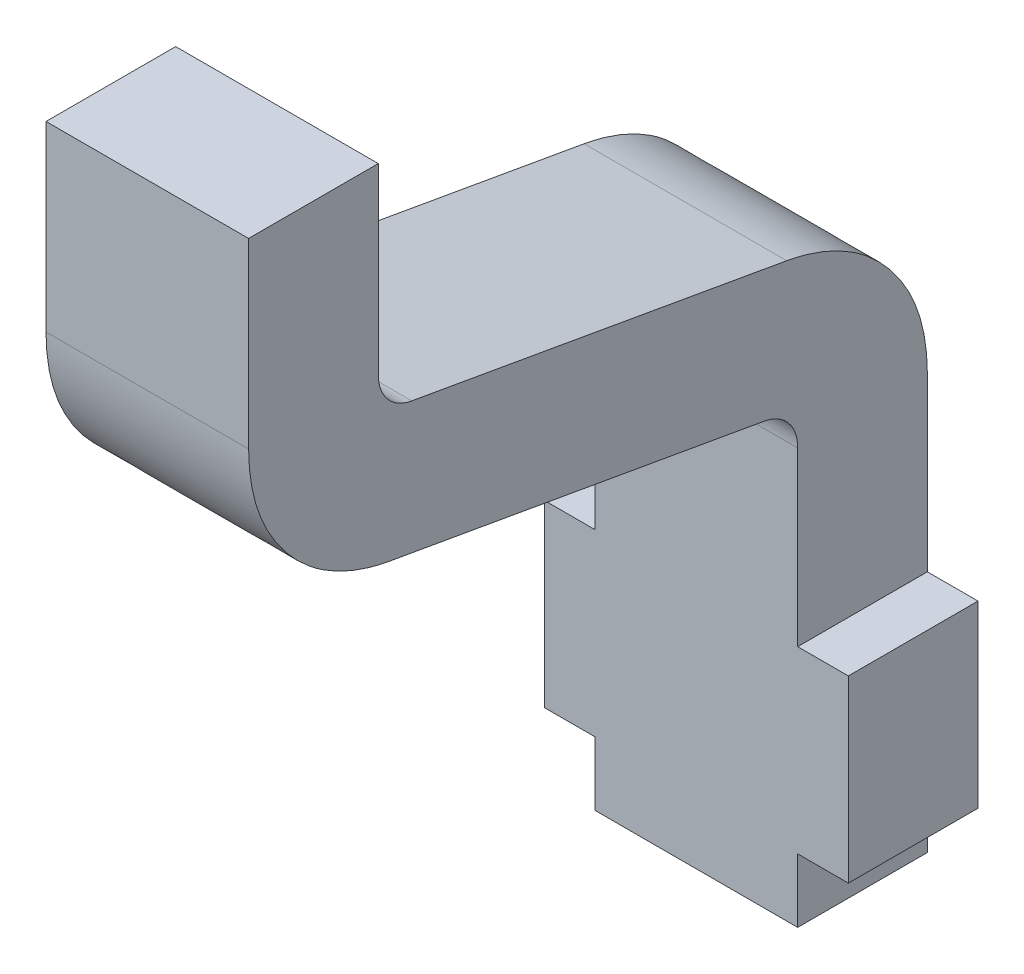
ISO-10303-21;
HEADER;
FILE_DESCRIPTION(('STEP AP214'),'2;1');
FILE_NAME('part.step','',(''),(''),'','','');
FILE_SCHEMA(('AUTOMOTIVE_DESIGN { 1 0 10303 214 1 1 1 1 }'));
ENDSEC;
DATA;
#1=APPLICATION_CONTEXT('core data for automotive mechanical design processes');
#2=APPLICATION_PROTOCOL_DEFINITION('international standard','automotive_design',2000,#1);
#3=PRODUCT_CONTEXT('',#1,'mechanical');
#4=PRODUCT('Part','Part','',(#3));
#5=PRODUCT_RELATED_PRODUCT_CATEGORY('part','',(#4));
#6=PRODUCT_DEFINITION_FORMATION('','',#4);
#7=PRODUCT_DEFINITION_CONTEXT('part definition',#1,'design');
#8=PRODUCT_DEFINITION('design','',#6,#7);
#9=PRODUCT_DEFINITION_SHAPE('','',#8);
#10=(LENGTH_UNIT() NAMED_UNIT(*) SI_UNIT(.MILLI.,.METRE.));
#11=(NAMED_UNIT(*) PLANE_ANGLE_UNIT() SI_UNIT($,.RADIAN.));
#12=(NAMED_UNIT(*) SI_UNIT($,.STERADIAN.) SOLID_ANGLE_UNIT());
#13=UNCERTAINTY_MEASURE_WITH_UNIT(LENGTH_MEASURE(1.E-05),#10,'distance_accuracy_value','');
#14=(GEOMETRIC_REPRESENTATION_CONTEXT(3) GLOBAL_UNCERTAINTY_ASSIGNED_CONTEXT((#13)) GLOBAL_UNIT_ASSIGNED_CONTEXT((#10,
#11,#12)) REPRESENTATION_CONTEXT('',''));
#15=CARTESIAN_POINT('',(0.,0.,0.));
#16=DIRECTION('',(0.,0.,1.));
#17=DIRECTION('',(1.,0.,0.));
#18=AXIS2_PLACEMENT_3D('',#15,#16,#17);
#19=CARTESIAN_POINT('',(-4.23863807396374,4.550984547896,3.510984547896));
#20=DIRECTION('',(-1.,0.,0.));
#21=DIRECTION('',(0.,0.,1.));
#22=AXIS2_PLACEMENT_3D('',#19,#20,#21);
#23=PLANE('',#22);
#24=DIRECTION('',(0.,1.,0.));
#25=VECTOR('',#24,1.);
#26=CARTESIAN_POINT('',(-4.23863807396374,5.13572968446735,3.540984547896));
#27=LINE('',#26,#25);
#28=CARTESIAN_POINT('',(-4.23863807396374,4.580984547896,3.540984547896));
#29=VERTEX_POINT('',#28);
#30=CARTESIAN_POINT('',(-4.23863807396374,5.00572968446735,3.540984547896));
#31=VERTEX_POINT('',#30);
#32=EDGE_CURVE('E329',#29,#31,#27,.T.);
#33=ORIENTED_EDGE('',*,*,#32,.F.);
#34=DIRECTION('',(0.,0.,1.));
#35=VECTOR('',#34,1.);
#36=CARTESIAN_POINT('',(-4.23863807396374,4.580984547896,3.860984547896));
#37=LINE('',#36,#35);
#38=CARTESIAN_POINT('',(-4.23863807396374,4.580984547896,3.860984547896));
#39=VERTEX_POINT('',#38);
#40=EDGE_CURVE('E382',#39,#29,#37,.F.);
#41=ORIENTED_EDGE('',*,*,#40,.F.);
#42=DIRECTION('',(0.,-1.,0.));
#43=VECTOR('',#42,1.);
#44=CARTESIAN_POINT('',(-4.23863807396374,3.850984547896,3.860984547896));
#45=LINE('',#44,#43);
#46=CARTESIAN_POINT('',(-4.23863807396374,5.00572968446735,3.860984547896));
#47=VERTEX_POINT('',#46);
#48=EDGE_CURVE('E395',#47,#39,#45,.T.);
#49=ORIENTED_EDGE('',*,*,#48,.F.);
#50=CARTESIAN_POINT('',(-4.23863807396374,5.10421045612507,3.94361973012931));
#51=CARTESIAN_POINT('',(-4.23863807396374,5.10322142133398,3.93797713168064));
#52=CARTESIAN_POINT('',(-4.23863807396374,5.10180655767696,3.93239259016885));
#53=CARTESIAN_POINT('',(-4.23863807396374,5.09809263275428,3.92153441184864));
#54=CARTESIAN_POINT('',(-4.23863807396374,5.09579441039471,3.91626048551944));
#55=CARTESIAN_POINT('',(-4.23863807396374,5.09026401442878,3.9061787201457));
#56=CARTESIAN_POINT('',(-4.23863807396374,5.08702667382654,3.90137366175097));
#57=CARTESIAN_POINT('',(-4.23863807396374,5.07974127460619,3.89244062734786));
#58=CARTESIAN_POINT('',(-4.23863807396374,5.07569328504229,3.88831259372234));
#59=CARTESIAN_POINT('',(-4.23863807396374,5.06312521819571,3.87754471111877));
#60=CARTESIAN_POINT('',(-4.23863807396374,5.05376794993399,3.87182515015808));
#61=CARTESIAN_POINT('',(-4.23863807396374,5.03362024476698,3.8639211587162));
#62=CARTESIAN_POINT('',(-4.23863807396374,5.02282205342787,3.86175676430971));
#63=CARTESIAN_POINT('',(-4.23863807396374,5.0099185301986,3.86104181849125));
#64=CARTESIAN_POINT('',(-4.23863807396374,5.00782176653818,3.86098457644425));
#65=CARTESIAN_POINT('',(-4.23863807396374,5.00572968446735,3.860984547896));
#66=B_SPLINE_CURVE_WITH_KNOTS('',3,(#50,#51,#52,#53,#54,#55,#56,#57,#58,#59,#60,#61,#62,#63,#64,
#65),.UNSPECIFIED.,.F.,.F.,(4,2,2,2,2,2,2,4),(0.,0.0171952934727819,0.0343742971456971,
0.0516496723671969,0.0689235766309651,0.101155477144058,0.133568413413415,0.139856079976676),.UNSPECIFIED.);
#67=CARTESIAN_POINT('',(-4.23863807396374,5.10421045612507,3.94361973012931));
#68=VERTEX_POINT('',#67);
#69=EDGE_CURVE('E211',#68,#47,#66,.T.);
#70=ORIENTED_EDGE('',*,*,#69,.F.);
#71=DIRECTION('',(0.,-0.173648177666932,-0.984807753012208));
#72=VECTOR('',#71,1.);
#73=CARTESIAN_POINT('',(-4.23863807396374,5.09900101079506,3.91407549753894));
#74=LINE('',#73,#72);
#75=CARTESIAN_POINT('',(-4.23863807396374,5.26736529163088,4.86891678251611));
#76=VERTEX_POINT('',#75);
#77=EDGE_CURVE('E308',#76,#68,#74,.T.);
#78=ORIENTED_EDGE('',*,*,#77,.F.);
#79=CARTESIAN_POINT('',(-4.23863807396374,5.680984547896,5.215984547896));
#80=CARTESIAN_POINT('',(-4.23863807396374,5.66890127228763,5.21595183134327));
#81=CARTESIAN_POINT('',(-4.23863807396374,5.65682002878392,5.21549217076271));
#82=CARTESIAN_POINT('',(-4.23863807396374,5.632717050206,5.21365115180732));
#83=CARTESIAN_POINT('',(-4.23863807396374,5.62069538460906,5.21226889552659));
#84=CARTESIAN_POINT('',(-4.23863807396374,5.58488337982936,5.20664461003981));
#85=CARTESIAN_POINT('',(-4.23863807396374,5.56130015398738,5.20092544100753));
#86=CARTESIAN_POINT('',(-4.23863807396374,5.51541142429561,5.18528840874306));
#87=CARTESIAN_POINT('',(-4.23863807396374,5.49311397180998,5.17534679307765));
#88=CARTESIAN_POINT('',(-4.23863807396374,5.45073394795254,5.15155132631248));
#89=CARTESIAN_POINT('',(-4.23863807396374,5.43065089102061,5.13769833525868));
#90=CARTESIAN_POINT('',(-4.23863807396374,5.3943942747384,5.10780679930005));
#91=CARTESIAN_POINT('',(-4.23863807396374,5.37804960291591,5.09197467048318));
#92=CARTESIAN_POINT('',(-4.23863807396374,5.34828458384632,5.05776745620607));
#93=CARTESIAN_POINT('',(-4.23863807396374,5.33486206283398,5.03939427776633));
#94=CARTESIAN_POINT('',(-4.23863807396374,5.3113048077432,5.00055783492392));
#95=CARTESIAN_POINT('',(-4.23863807396374,5.30118358018563,4.9800864237183));
#96=CARTESIAN_POINT('',(-4.23863807396374,5.28435011523199,4.93781184445851));
#97=CARTESIAN_POINT('',(-4.23863807396374,5.27763661930502,4.91600917139863));
#98=CARTESIAN_POINT('',(-4.23863807396374,5.27056434539121,4.88559038653975));
#99=CARTESIAN_POINT('',(-4.23863807396374,5.2688591768769,4.87726896710838));
#100=CARTESIAN_POINT('',(-4.23863807396374,5.26736529163088,4.86891678251611));
#101=B_SPLINE_CURVE_WITH_KNOTS('',3,(#79,#80,#81,#82,#83,#84,#85,#86,#87,#88,#89,#90,#91,#92,
#93,#94,#95,#96,#97,#98,#99,#100),.UNSPECIFIED.,.F.,.F.,(4,2,2,2,2,2,2,2,2,2,4),(0.,
0.0362376750170137,0.0725106694701073,0.144920581778823,0.217743330301196,0.290550078773815,
0.358518516265929,0.426436218478266,0.494628403889814,0.562795386457141,0.588263112680089),.UNSPECIFIED.);
#102=CARTESIAN_POINT('',(-4.23863807396374,5.680984547896,5.215984547896));
#103=VERTEX_POINT('',#102);
#104=EDGE_CURVE('E265',#103,#76,#101,.T.);
#105=ORIENTED_EDGE('',*,*,#104,.F.);
#106=DIRECTION('',(0.,-1.,0.));
#107=VECTOR('',#106,1.);
#108=CARTESIAN_POINT('',(-4.23863807396374,5.650984547896,5.215984547896));
#109=LINE('',#108,#107);
#110=CARTESIAN_POINT('',(-4.23863807396374,6.130984547896,5.215984547896));
#111=VERTEX_POINT('',#110);
#112=EDGE_CURVE('E266',#111,#103,#109,.T.);
#113=ORIENTED_EDGE('',*,*,#112,.F.);
#114=DIRECTION('',(0.,0.,-1.));
#115=VECTOR('',#114,1.);
#116=CARTESIAN_POINT('',(-4.23863807396374,6.130984547896,5.245984547896));
#117=LINE('',#116,#115);
#118=CARTESIAN_POINT('',(-4.23863807396374,6.130984547896,4.895984547896));
#119=VERTEX_POINT('',#118);
#120=EDGE_CURVE('E280',#111,#119,#117,.T.);
#121=ORIENTED_EDGE('',*,*,#120,.T.);
#122=DIRECTION('',(0.,1.,0.));
#123=VECTOR('',#122,1.);
#124=CARTESIAN_POINT('',(-4.23863807396374,5.650984547896,4.895984547896));
#125=LINE('',#124,#123);
#126=CARTESIAN_POINT('',(-4.23863807396374,5.680984547896,4.895984547896));
#127=VERTEX_POINT('',#126);
#128=EDGE_CURVE('E285',#127,#119,#125,.T.);
#129=ORIENTED_EDGE('',*,*,#128,.F.);
#130=CARTESIAN_POINT('',(-4.23863807396374,5.58250377259478,4.8133493656627));
#131=CARTESIAN_POINT('',(-4.23863807396374,5.58349280735009,4.81899196391534));
#132=CARTESIAN_POINT('',(-4.23863807396374,5.58490767095764,4.82457650523169));
#133=CARTESIAN_POINT('',(-4.23863807396374,5.58862159574407,4.83543468316471));
#134=CARTESIAN_POINT('',(-4.23863807396374,5.59091981801547,4.84070860930265));
#135=CARTESIAN_POINT('',(-4.23863807396374,5.59645021375978,4.85079037431742));
#136=CARTESIAN_POINT('',(-4.23863807396374,5.59968755422818,4.85559543254468));
#137=CARTESIAN_POINT('',(-4.23863807396374,5.60697295314034,4.86452846665608));
#138=CARTESIAN_POINT('',(-4.23863807396374,5.61102094253025,4.86865650015707));
#139=CARTESIAN_POINT('',(-4.23863807396374,5.62358900897739,4.87942438268163));
#140=CARTESIAN_POINT('',(-4.23863807396374,5.63294627698876,4.88514394372606));
#141=CARTESIAN_POINT('',(-4.23863807396374,5.65309398228847,4.89304793596919));
#142=CARTESIAN_POINT('',(-4.23863807396374,5.66389217410044,4.895212330863));
#143=CARTESIAN_POINT('',(-4.23863807396374,5.67679569930714,4.89592727722996));
#144=CARTESIAN_POINT('',(-4.23863807396374,5.67889246439949,4.89598451934975));
#145=CARTESIAN_POINT('',(-4.23863807396374,5.680984547896,4.895984547896));
#146=B_SPLINE_CURVE_WITH_KNOTS('',3,(#130,#131,#132,#133,#134,#135,#136,#137,#138,#139,#140,
#141,#142,#143,#144,#145),.UNSPECIFIED.,.F.,.F.,(4,2,2,2,2,2,2,4),(0.,0.0171952928725208,
0.034374295917783,0.0516496705054831,0.0689235741430784,0.101155474241676,0.133568412187271,
0.139856083041267),.UNSPECIFIED.);
#147=CARTESIAN_POINT('',(-4.23863807396374,5.58250377259478,4.8133493656627));
#148=VERTEX_POINT('',#147);
#149=EDGE_CURVE('E159',#148,#127,#146,.T.);
#150=ORIENTED_EDGE('',*,*,#149,.F.);
#151=DIRECTION('',(0.,0.173648177666932,0.984807753012208));
#152=VECTOR('',#151,1.);
#153=CARTESIAN_POINT('',(-4.23863807396374,5.41413949175897,3.85850808068553));
#154=LINE('',#153,#152);
#155=CARTESIAN_POINT('',(-4.23863807396374,5.41934893708898,3.88805231327589));
#156=VERTEX_POINT('',#155);
#157=EDGE_CURVE('E157',#156,#148,#154,.T.);
#158=ORIENTED_EDGE('',*,*,#157,.F.);
#159=CARTESIAN_POINT('',(-4.23863807396374,5.00572968446735,3.540984547896));
#160=CARTESIAN_POINT('',(-4.23863807396374,5.01781295987927,3.54101726444863));
#161=CARTESIAN_POINT('',(-4.23863807396374,5.02989420318648,3.54147692502501));
#162=CARTESIAN_POINT('',(-4.23863807396374,5.0539971813711,3.54331794396099));
#163=CARTESIAN_POINT('',(-4.23863807396374,5.06601884677125,3.54470020022645));
#164=CARTESIAN_POINT('',(-4.23863807396374,5.10183085095396,3.55032448564514));
#165=CARTESIAN_POINT('',(-4.23863807396374,5.12541407639748,3.55604365460232));
#166=CARTESIAN_POINT('',(-4.23863807396374,5.17130280531032,3.57168068663134));
#167=CARTESIAN_POINT('',(-4.23863807396374,5.19360025741589,3.58162230213518));
#168=CARTESIAN_POINT('',(-4.23863807396374,5.23598028056588,3.60541776849081));
#169=CARTESIAN_POINT('',(-4.23863807396374,5.25606333717013,3.61927075929715));
#170=CARTESIAN_POINT('',(-4.23863807396374,5.29231995298431,3.64916229477004));
#171=CARTESIAN_POINT('',(-4.23863807396374,5.30866462464947,3.66499442336857));
#172=CARTESIAN_POINT('',(-4.23863807396374,5.33842964348686,3.6992016371545));
#173=CARTESIAN_POINT('',(-4.23863807396374,5.35185216442404,3.71757481532164));
#174=CARTESIAN_POINT('',(-4.23863807396374,5.37540941959501,3.7564112578163));
#175=CARTESIAN_POINT('',(-4.23863807396374,5.38553064726898,3.77688266897037));
#176=CARTESIAN_POINT('',(-4.23863807396374,5.40236411247126,3.81915724814487));
#177=CARTESIAN_POINT('',(-4.23863807396374,5.40907760852998,3.84095992117117));
#178=CARTESIAN_POINT('',(-4.23863807396374,5.41614988288698,3.87137870707725));
#179=CARTESIAN_POINT('',(-4.23863807396374,5.41785505164856,3.87970012759237));
#180=CARTESIAN_POINT('',(-4.23863807396374,5.41934893708898,3.88805231327589));
#181=B_SPLINE_CURVE_WITH_KNOTS('',3,(#159,#160,#161,#162,#163,#164,#165,#166,#167,#168,#169,
#170,#171,#172,#173,#174,#175,#176,#177,#178,#179,#180),.UNSPECIFIED.,.F.,.F.,(4,2,2,2,2,2,2,2,
2,2,4),(0.,0.0362376744277039,0.072510668289158,0.144920579389959,0.217743326684424,
0.290550073938625,0.35851851064532,0.426436212078582,0.494628397505418,0.562795380097965,
0.588263109649129),.UNSPECIFIED.);
#182=EDGE_CURVE('E21',#31,#156,#181,.T.);
#183=ORIENTED_EDGE('',*,*,#182,.F.);
#184=EDGE_LOOP('',(#33,#41,#49,#70,#78,#105,#113,#121,#129,#150,#158,#183));
#185=FACE_BOUND('',#184,.T.);
#186=ADVANCED_FACE('F17',(#185),#23,.T.);
#187=CARTESIAN_POINT('',(-4.36363807396374,4.580984547896,3.860984547896));
#188=DIRECTION('',(0.,1.,0.));
#189=DIRECTION('',(0.,0.,1.));
#190=AXIS2_PLACEMENT_3D('',#187,#188,#189);
#191=PLANE('',#190);
#192=DIRECTION('',(0.,0.,1.));
#193=VECTOR('',#192,1.);
#194=CARTESIAN_POINT('',(-4.36363807396374,4.580984547896,3.860984547896));
#195=LINE('',#194,#193);
#196=CARTESIAN_POINT('',(-4.36363807396374,4.580984547896,3.860984547896));
#197=VERTEX_POINT('',#196);
#198=CARTESIAN_POINT('',(-4.36363807396374,4.580984547896,3.540984547896));
#199=VERTEX_POINT('',#198);
#200=EDGE_CURVE('E376',#197,#199,#195,.F.);
#201=ORIENTED_EDGE('',*,*,#200,.F.);
#202=DIRECTION('',(1.,0.,0.));
#203=VECTOR('',#202,1.);
#204=CARTESIAN_POINT('',(-4.50113807396374,4.580984547896,3.860984547896));
#205=LINE('',#204,#203);
#206=EDGE_CURVE('E386',#39,#197,#205,.F.);
#207=ORIENTED_EDGE('',*,*,#206,.F.);
#208=ORIENTED_EDGE('',*,*,#40,.T.);
#209=DIRECTION('',(1.,0.,0.));
#210=VECTOR('',#209,1.);
#211=CARTESIAN_POINT('',(-4.50113807396374,4.580984547896,3.540984547896));
#212=LINE('',#211,#210);
#213=EDGE_CURVE('E171',#199,#29,#212,.T.);
#214=ORIENTED_EDGE('',*,*,#213,.F.);
#215=EDGE_LOOP('',(#201,#207,#208,#214));
#216=FACE_BOUND('',#215,.T.);
#217=ADVANCED_FACE('F385',(#216),#191,.T.);
#218=CARTESIAN_POINT('',(-4.36363807396374,4.1381566124251,3.860984547896));
#219=DIRECTION('',(-1.,0.,0.));
#220=DIRECTION('',(0.,-1.,0.));
#221=AXIS2_PLACEMENT_3D('',#218,#219,#220);
#222=PLANE('',#221);
#223=DIRECTION('',(0.,1.,0.));
#224=VECTOR('',#223,1.);
#225=CARTESIAN_POINT('',(-4.36363807396374,5.13572968446735,3.540984547896));
#226=LINE('',#225,#224);
#227=CARTESIAN_POINT('',(-4.36363807396374,4.1381566124251,3.540984547896));
#228=VERTEX_POINT('',#227);
#229=EDGE_CURVE('E343',#228,#199,#226,.T.);
#230=ORIENTED_EDGE('',*,*,#229,.F.);
#231=DIRECTION('',(0.,0.,1.));
#232=VECTOR('',#231,1.);
#233=CARTESIAN_POINT('',(-4.36363807396374,4.1381566124251,3.860984547896));
#234=LINE('',#233,#232);
#235=CARTESIAN_POINT('',(-4.36363807396374,4.1381566124251,3.860984547896));
#236=VERTEX_POINT('',#235);
#237=EDGE_CURVE('E374',#236,#228,#234,.F.);
#238=ORIENTED_EDGE('',*,*,#237,.F.);
#239=DIRECTION('',(0.,-1.,0.));
#240=VECTOR('',#239,1.);
#241=CARTESIAN_POINT('',(-4.36363807396374,3.850984547896,3.860984547896));
#242=LINE('',#241,#240);
#243=EDGE_CURVE('E378',#197,#236,#242,.T.);
#244=ORIENTED_EDGE('',*,*,#243,.F.);
#245=ORIENTED_EDGE('',*,*,#200,.T.);
#246=EDGE_LOOP('',(#230,#238,#244,#245));
#247=FACE_BOUND('',#246,.T.);
#248=ADVANCED_FACE('F372',(#247),#222,.T.);
#249=CARTESIAN_POINT('',(-4.23863807396374,4.1381566124251,3.860984547896));
#250=DIRECTION('',(0.,-1.,0.));
#251=DIRECTION('',(1.,0.,0.));
#252=AXIS2_PLACEMENT_3D('',#249,#250,#251);
#253=PLANE('',#252);
#254=DIRECTION('',(1.,0.,0.));
#255=VECTOR('',#254,1.);
#256=CARTESIAN_POINT('',(-4.50113807396374,4.1381566124251,3.540984547896));
#257=LINE('',#256,#255);
#258=CARTESIAN_POINT('',(-4.23863807396374,4.1381566124251,3.540984547896));
#259=VERTEX_POINT('',#258);
#260=EDGE_CURVE('E358',#259,#228,#257,.F.);
#261=ORIENTED_EDGE('',*,*,#260,.F.);
#262=DIRECTION('',(0.,0.,1.));
#263=VECTOR('',#262,1.);
#264=CARTESIAN_POINT('',(-4.23863807396374,4.1381566124251,3.860984547896));
#265=LINE('',#264,#263);
#266=CARTESIAN_POINT('',(-4.23863807396374,4.1381566124251,3.860984547896));
#267=VERTEX_POINT('',#266);
#268=EDGE_CURVE('E498',#267,#259,#265,.F.);
#269=ORIENTED_EDGE('',*,*,#268,.F.);
#270=DIRECTION('',(1.,0.,0.));
#271=VECTOR('',#270,1.);
#272=CARTESIAN_POINT('',(-4.50113807396374,4.1381566124251,3.860984547896));
#273=LINE('',#272,#271);
#274=EDGE_CURVE('E503',#236,#267,#273,.T.);
#275=ORIENTED_EDGE('',*,*,#274,.F.);
#276=ORIENTED_EDGE('',*,*,#237,.T.);
#277=EDGE_LOOP('',(#261,#269,#275,#276));
#278=FACE_BOUND('',#277,.T.);
#279=ADVANCED_FACE('F522',(#278),#253,.T.);
#280=CARTESIAN_POINT('',(-4.23863807396374,3.980984547896,3.860984547896));
#281=DIRECTION('',(-1.,0.,0.));
#282=DIRECTION('',(0.,-1.,0.));
#283=AXIS2_PLACEMENT_3D('',#280,#281,#282);
#284=PLANE('',#283);
#285=DIRECTION('',(0.,1.,0.));
#286=VECTOR('',#285,1.);
#287=CARTESIAN_POINT('',(-4.23863807396374,5.13572968446735,3.540984547896));
#288=LINE('',#287,#286);
#289=CARTESIAN_POINT('',(-4.23863807396374,3.980984547896,3.540984547896));
#290=VERTEX_POINT('',#289);
#291=EDGE_CURVE('E353',#290,#259,#288,.T.);
#292=ORIENTED_EDGE('',*,*,#291,.F.);
#293=DIRECTION('',(0.,0.,-1.));
#294=VECTOR('',#293,1.);
#295=CARTESIAN_POINT('',(-4.23863807396374,3.980984547896,3.860984547896));
#296=LINE('',#295,#294);
#297=CARTESIAN_POINT('',(-4.23863807396374,3.980984547896,3.860984547896));
#298=VERTEX_POINT('',#297);
#299=EDGE_CURVE('E489',#298,#290,#296,.T.);
#300=ORIENTED_EDGE('',*,*,#299,.F.);
#301=DIRECTION('',(0.,-1.,0.));
#302=VECTOR('',#301,1.);
#303=CARTESIAN_POINT('',(-4.23863807396374,3.850984547896,3.860984547896));
#304=LINE('',#303,#302);
#305=EDGE_CURVE('E494',#267,#298,#304,.T.);
#306=ORIENTED_EDGE('',*,*,#305,.F.);
#307=ORIENTED_EDGE('',*,*,#268,.T.);
#308=EDGE_LOOP('',(#292,#300,#306,#307));
#309=FACE_BOUND('',#308,.T.);
#310=ADVANCED_FACE('F525',(#309),#284,.T.);
#311=CARTESIAN_POINT('',(-3.73863807396374,3.980984547896,3.860984547896));
#312=DIRECTION('',(0.,-1.,0.));
#313=DIRECTION('',(0.,0.,-1.));
#314=AXIS2_PLACEMENT_3D('',#311,#312,#313);
#315=PLANE('',#314);
#316=DIRECTION('',(1.,0.,0.));
#317=VECTOR('',#316,1.);
#318=CARTESIAN_POINT('',(-4.50113807396374,3.980984547896,3.540984547896));
#319=LINE('',#318,#317);
#320=CARTESIAN_POINT('',(-3.73863807396374,3.980984547896,3.540984547896));
#321=VERTEX_POINT('',#320);
#322=EDGE_CURVE('E348',#321,#290,#319,.F.);
#323=ORIENTED_EDGE('',*,*,#322,.F.);
#324=DIRECTION('',(0.,0.,-1.));
#325=VECTOR('',#324,1.);
#326=CARTESIAN_POINT('',(-3.73863807396374,3.980984547896,3.860984547896));
#327=LINE('',#326,#325);
#328=CARTESIAN_POINT('',(-3.73863807396374,3.980984547896,3.860984547896));
#329=VERTEX_POINT('',#328);
#330=EDGE_CURVE('E481',#329,#321,#327,.T.);
#331=ORIENTED_EDGE('',*,*,#330,.F.);
#332=DIRECTION('',(1.,0.,0.));
#333=VECTOR('',#332,1.);
#334=CARTESIAN_POINT('',(-4.50113807396374,3.980984547896,3.860984547896));
#335=LINE('',#334,#333);
#336=EDGE_CURVE('E485',#298,#329,#335,.T.);
#337=ORIENTED_EDGE('',*,*,#336,.F.);
#338=ORIENTED_EDGE('',*,*,#299,.T.);
#339=EDGE_LOOP('',(#323,#331,#337,#338));
#340=FACE_BOUND('',#339,.T.);
#341=ADVANCED_FACE('F529',(#340),#315,.T.);
#342=CARTESIAN_POINT('',(-3.73863807396374,4.1381566124251,3.860984547896));
#343=DIRECTION('',(1.,0.,0.));
#344=DIRECTION('',(0.,0.,-1.));
#345=AXIS2_PLACEMENT_3D('',#342,#343,#344);
#346=PLANE('',#345);
#347=DIRECTION('',(0.,1.,0.));
#348=VECTOR('',#347,1.);
#349=CARTESIAN_POINT('',(-3.73863807396374,5.13572968446735,3.540984547896));
#350=LINE('',#349,#348);
#351=CARTESIAN_POINT('',(-3.73863807396374,4.1381566124251,3.540984547896));
#352=VERTEX_POINT('',#351);
#353=EDGE_CURVE('E338',#352,#321,#350,.F.);
#354=ORIENTED_EDGE('',*,*,#353,.F.);
#355=DIRECTION('',(0.,0.,-1.));
#356=VECTOR('',#355,1.);
#357=CARTESIAN_POINT('',(-3.73863807396374,4.1381566124251,3.860984547896));
#358=LINE('',#357,#356);
#359=CARTESIAN_POINT('',(-3.73863807396374,4.1381566124251,3.860984547896));
#360=VERTEX_POINT('',#359);
#361=EDGE_CURVE('E473',#360,#352,#358,.T.);
#362=ORIENTED_EDGE('',*,*,#361,.F.);
#363=DIRECTION('',(0.,-1.,0.));
#364=VECTOR('',#363,1.);
#365=CARTESIAN_POINT('',(-3.73863807396374,3.850984547896,3.860984547896));
#366=LINE('',#365,#364);
#367=EDGE_CURVE('E477',#329,#360,#366,.F.);
#368=ORIENTED_EDGE('',*,*,#367,.F.);
#369=ORIENTED_EDGE('',*,*,#330,.T.);
#370=EDGE_LOOP('',(#354,#362,#368,#369));
#371=FACE_BOUND('',#370,.T.);
#372=ADVANCED_FACE('F533',(#371),#346,.T.);
#373=CARTESIAN_POINT('',(-3.61363807396374,4.1381566124251,3.860984547896));
#374=DIRECTION('',(0.,-1.,0.));
#375=DIRECTION('',(0.,0.,-1.));
#376=AXIS2_PLACEMENT_3D('',#373,#374,#375);
#377=PLANE('',#376);
#378=DIRECTION('',(1.,0.,0.));
#379=VECTOR('',#378,1.);
#380=CARTESIAN_POINT('',(-4.50113807396374,4.1381566124251,3.540984547896));
#381=LINE('',#380,#379);
#382=CARTESIAN_POINT('',(-3.61363807396374,4.1381566124251,3.540984547896));
#383=VERTEX_POINT('',#382);
#384=EDGE_CURVE('E335',#383,#352,#381,.F.);
#385=ORIENTED_EDGE('',*,*,#384,.F.);
#386=DIRECTION('',(0.,0.,-1.));
#387=VECTOR('',#386,1.);
#388=CARTESIAN_POINT('',(-3.61363807396374,4.1381566124251,3.860984547896));
#389=LINE('',#388,#387);
#390=CARTESIAN_POINT('',(-3.61363807396374,4.1381566124251,3.860984547896));
#391=VERTEX_POINT('',#390);
#392=EDGE_CURVE('E332',#391,#383,#389,.T.);
#393=ORIENTED_EDGE('',*,*,#392,.F.);
#394=DIRECTION('',(1.,0.,0.));
#395=VECTOR('',#394,1.);
#396=CARTESIAN_POINT('',(-4.50113807396374,4.1381566124251,3.860984547896));
#397=LINE('',#396,#395);
#398=EDGE_CURVE('E433',#360,#391,#397,.T.);
#399=ORIENTED_EDGE('',*,*,#398,.F.);
#400=ORIENTED_EDGE('',*,*,#361,.T.);
#401=EDGE_LOOP('',(#385,#393,#399,#400));
#402=FACE_BOUND('',#401,.T.);
#403=ADVANCED_FACE('F536',(#402),#377,.T.);
#404=CARTESIAN_POINT('',(-3.61363807396374,4.580984547896,3.860984547896));
#405=DIRECTION('',(1.,0.,0.));
#406=DIRECTION('',(0.,0.,-1.));
#407=AXIS2_PLACEMENT_3D('',#404,#405,#406);
#408=PLANE('',#407);
#409=DIRECTION('',(0.,1.,0.));
#410=VECTOR('',#409,1.);
#411=CARTESIAN_POINT('',(-3.61363807396374,5.13572968446735,3.540984547896));
#412=LINE('',#411,#410);
#413=CARTESIAN_POINT('',(-3.61363807396374,4.580984547896,3.540984547896));
#414=VERTEX_POINT('',#413);
#415=EDGE_CURVE('E331',#414,#383,#412,.F.);
#416=ORIENTED_EDGE('',*,*,#415,.F.);
#417=DIRECTION('',(0.,0.,1.));
#418=VECTOR('',#417,1.);
#419=CARTESIAN_POINT('',(-3.61363807396374,4.580984547896,3.860984547896));
#420=LINE('',#419,#418);
#421=CARTESIAN_POINT('',(-3.61363807396374,4.580984547896,3.860984547896));
#422=VERTEX_POINT('',#421);
#423=EDGE_CURVE('E406',#422,#414,#420,.F.);
#424=ORIENTED_EDGE('',*,*,#423,.F.);
#425=DIRECTION('',(0.,-1.,0.));
#426=VECTOR('',#425,1.);
#427=CARTESIAN_POINT('',(-3.61363807396374,3.850984547896,3.860984547896));
#428=LINE('',#427,#426);
#429=EDGE_CURVE('E407',#391,#422,#428,.F.);
#430=ORIENTED_EDGE('',*,*,#429,.F.);
#431=ORIENTED_EDGE('',*,*,#392,.T.);
#432=EDGE_LOOP('',(#416,#424,#430,#431));
#433=FACE_BOUND('',#432,.T.);
#434=ADVANCED_FACE('F437',(#433),#408,.T.);
#435=CARTESIAN_POINT('',(-4.50113807396374,5.13572968446735,3.540984547896));
#436=DIRECTION('',(0.,0.,-1.));
#437=DIRECTION('',(0.,1.,0.));
#438=AXIS2_PLACEMENT_3D('',#435,#436,#437);
#439=PLANE('',#438);
#440=ORIENTED_EDGE('',*,*,#229,.T.);
#441=ORIENTED_EDGE('',*,*,#213,.T.);
#442=ORIENTED_EDGE('',*,*,#32,.T.);
#443=DIRECTION('',(1.,0.,0.));
#444=VECTOR('',#443,1.);
#445=CARTESIAN_POINT('',(-4.23863807396374,5.00572968446735,3.540984547896));
#446=LINE('',#445,#444);
#447=CARTESIAN_POINT('',(-3.73863807396374,5.00572968446735,3.540984547896));
#448=VERTEX_POINT('',#447);
#449=EDGE_CURVE('E164',#448,#31,#446,.F.);
#450=ORIENTED_EDGE('',*,*,#449,.F.);
#451=DIRECTION('',(0.,1.,0.));
#452=VECTOR('',#451,1.);
#453=CARTESIAN_POINT('',(-3.73863807396374,4.550984547896,3.540984547896));
#454=LINE('',#453,#452);
#455=CARTESIAN_POINT('',(-3.73863807396374,4.580984547896,3.540984547896));
#456=VERTEX_POINT('',#455);
#457=EDGE_CURVE('E205',#456,#448,#454,.T.);
#458=ORIENTED_EDGE('',*,*,#457,.F.);
#459=DIRECTION('',(1.,0.,0.));
#460=VECTOR('',#459,1.);
#461=CARTESIAN_POINT('',(-4.36363807396374,4.580984547896,3.540984547896));
#462=LINE('',#461,#460);
#463=EDGE_CURVE('E441',#414,#456,#462,.F.);
#464=ORIENTED_EDGE('',*,*,#463,.F.);
#465=ORIENTED_EDGE('',*,*,#415,.T.);
#466=ORIENTED_EDGE('',*,*,#384,.T.);
#467=ORIENTED_EDGE('',*,*,#353,.T.);
#468=ORIENTED_EDGE('',*,*,#322,.T.);
#469=ORIENTED_EDGE('',*,*,#291,.T.);
#470=ORIENTED_EDGE('',*,*,#260,.T.);
#471=EDGE_LOOP('',(#440,#441,#442,#450,#458,#464,#465,#466,#467,#468,#469,#470));
#472=FACE_BOUND('',#471,.T.);
#473=ADVANCED_FACE('F193',(#472),#439,.T.);
#474=CARTESIAN_POINT('',(-4.23863807396374,5.00572968446735,3.540984547896));
#475=CARTESIAN_POINT('',(-4.23863807396374,5.11703735513449,3.5412846739726));
#476=CARTESIAN_POINT('',(-4.23863807396374,5.29675420145065,3.61415503314688));
#477=CARTESIAN_POINT('',(-4.23863807396374,5.39972499645732,3.77848777267262));
#478=CARTESIAN_POINT('',(-4.23863807396374,5.41934893708898,3.88805231327589));
#479=(BOUNDED_CURVE() B_SPLINE_CURVE(3,(#474,#475,#476,#477,#478),.UNSPECIFIED.,.F.,
.F.) B_SPLINE_CURVE_WITH_KNOTS((4,1,4),(0.,0.5,1.),
.UNSPECIFIED.) CURVE() GEOMETRIC_REPRESENTATION_ITEM() RATIONAL_B_SPLINE_CURVE((1.,1.,1.,1.,1.)) REPRESENTATION_ITEM(''));
#480=DIRECTION('',(1.,0.,0.));
#481=VECTOR('',#480,1.);
#482=SURFACE_OF_LINEAR_EXTRUSION('',#479,#481);
#483=CARTESIAN_POINT('',(-3.73863807396374,5.00572968446735,3.540984547896));
#484=CARTESIAN_POINT('',(-3.73863807396374,5.01781295987927,3.54101726444863));
#485=CARTESIAN_POINT('',(-3.73863807396374,5.02989420318648,3.54147692502501));
#486=CARTESIAN_POINT('',(-3.73863807396374,5.0539971813711,3.54331794396099));
#487=CARTESIAN_POINT('',(-3.73863807396374,5.06601884677125,3.54470020022645));
#488=CARTESIAN_POINT('',(-3.73863807396374,5.10183085095396,3.55032448564514));
#489=CARTESIAN_POINT('',(-3.73863807396374,5.12541407639748,3.55604365460232));
#490=CARTESIAN_POINT('',(-3.73863807396374,5.17130280531032,3.57168068663134));
#491=CARTESIAN_POINT('',(-3.73863807396374,5.19360025741589,3.58162230213518));
#492=CARTESIAN_POINT('',(-3.73863807396374,5.23598028056588,3.60541776849081));
#493=CARTESIAN_POINT('',(-3.73863807396374,5.25606333717013,3.61927075929715));
#494=CARTESIAN_POINT('',(-3.73863807396374,5.29231995298431,3.64916229477004));
#495=CARTESIAN_POINT('',(-3.73863807396374,5.30866462464947,3.66499442336857));
#496=CARTESIAN_POINT('',(-3.73863807396374,5.33842964348686,3.6992016371545));
#497=CARTESIAN_POINT('',(-3.73863807396374,5.35185216442404,3.71757481532164));
#498=CARTESIAN_POINT('',(-3.73863807396374,5.37540941959501,3.7564112578163));
#499=CARTESIAN_POINT('',(-3.73863807396374,5.38553064726898,3.77688266897037));
#500=CARTESIAN_POINT('',(-3.73863807396374,5.40236411247126,3.81915724814487));
#501=CARTESIAN_POINT('',(-3.73863807396374,5.40907760852998,3.84095992117117));
#502=CARTESIAN_POINT('',(-3.73863807396374,5.41614988288698,3.87137870707725));
#503=CARTESIAN_POINT('',(-3.73863807396374,5.41785505164856,3.87970012759237));
#504=CARTESIAN_POINT('',(-3.73863807396374,5.41934893708898,3.88805231327589));
#505=B_SPLINE_CURVE_WITH_KNOTS('',3,(#483,#484,#485,#486,#487,#488,#489,#490,#491,#492,#493,
#494,#495,#496,#497,#498,#499,#500,#501,#502,#503,#504),.UNSPECIFIED.,.F.,.F.,(4,2,2,2,2,2,2,2,
2,2,4),(0.,0.0362376744277039,0.072510668289158,0.144920579389959,0.217743326684424,
0.290550073938625,0.35851851064532,0.426436212078582,0.494628397505419,0.562795380097965,
0.588263109649129),.UNSPECIFIED.);
#506=CARTESIAN_POINT('',(-3.73863807396374,5.41934893708898,3.88805231327589));
#507=VERTEX_POINT('',#506);
#508=EDGE_CURVE('E198',#448,#507,#505,.T.);
#509=ORIENTED_EDGE('',*,*,#508,.F.);
#510=ORIENTED_EDGE('',*,*,#449,.T.);
#511=ORIENTED_EDGE('',*,*,#182,.T.);
#512=DIRECTION('',(1.,0.,0.));
#513=VECTOR('',#512,1.);
#514=CARTESIAN_POINT('',(-3.70863807396374,5.41934893708898,3.88805231327589));
#515=LINE('',#514,#513);
#516=EDGE_CURVE('E163',#507,#156,#515,.F.);
#517=ORIENTED_EDGE('',*,*,#516,.F.);
#518=EDGE_LOOP('',(#509,#510,#511,#517));
#519=FACE_BOUND('',#518,.T.);
#520=ADVANCED_FACE('F169',(#519),#482,.T.);
#521=CARTESIAN_POINT('',(-3.70863807396374,5.41413949175897,3.85850808068553));
#522=DIRECTION('',(0.,0.984807753012208,-0.173648177666932));
#523=DIRECTION('',(0.,0.173648177666932,0.984807753012208));
#524=AXIS2_PLACEMENT_3D('',#521,#522,#523);
#525=PLANE('',#524);
#526=DIRECTION('',(0.,0.173648177666922,0.98480775301221));
#527=VECTOR('',#526,1.);
#528=CARTESIAN_POINT('',(-3.73863807396374,5.41934893708898,3.88805231327589));
#529=LINE('',#528,#527);
#530=CARTESIAN_POINT('',(-3.73863807396374,5.58250377259478,4.8133493656627));
#531=VERTEX_POINT('',#530);
#532=EDGE_CURVE('E174',#507,#531,#529,.T.);
#533=ORIENTED_EDGE('',*,*,#532,.F.);
#534=ORIENTED_EDGE('',*,*,#516,.T.);
#535=ORIENTED_EDGE('',*,*,#157,.T.);
#536=DIRECTION('',(1.,0.,0.));
#537=VECTOR('',#536,1.);
#538=CARTESIAN_POINT('',(-4.23863807396374,5.58250377259478,4.8133493656627));
#539=LINE('',#538,#537);
#540=EDGE_CURVE('E177',#531,#148,#539,.F.);
#541=ORIENTED_EDGE('',*,*,#540,.F.);
#542=EDGE_LOOP('',(#533,#534,#535,#541));
#543=FACE_BOUND('',#542,.T.);
#544=ADVANCED_FACE('F172',(#543),#525,.T.);
#545=CARTESIAN_POINT('',(-4.23863807396374,5.58250377259478,4.8133493656627));
#546=CARTESIAN_POINT('',(-4.23863807396374,5.58713657599802,4.83944321638387));
#547=CARTESIAN_POINT('',(-4.23863807396374,5.61169299582134,4.87856300401742));
#548=CARTESIAN_POINT('',(-4.23863807396374,5.65448264353139,4.89595327681236));
#549=CARTESIAN_POINT('',(-4.23863807396374,5.680984547896,4.895984547896));
#550=(BOUNDED_CURVE() B_SPLINE_CURVE(3,(#545,#546,#547,#548,#549),.UNSPECIFIED.,.F.,
.F.) B_SPLINE_CURVE_WITH_KNOTS((4,1,4),(0.,0.5,1.),
.UNSPECIFIED.) CURVE() GEOMETRIC_REPRESENTATION_ITEM() RATIONAL_B_SPLINE_CURVE((1.,1.,1.,1.,1.)) REPRESENTATION_ITEM(''));
#551=DIRECTION('',(1.,0.,0.));
#552=VECTOR('',#551,1.);
#553=SURFACE_OF_LINEAR_EXTRUSION('',#550,#552);
#554=CARTESIAN_POINT('',(-3.73863807396374,5.58250377259478,4.8133493656627));
#555=CARTESIAN_POINT('',(-3.73863807396374,5.58349280735009,4.81899196391534));
#556=CARTESIAN_POINT('',(-3.73863807396374,5.58490767095764,4.82457650523169));
#557=CARTESIAN_POINT('',(-3.73863807396374,5.58862159574407,4.83543468316471));
#558=CARTESIAN_POINT('',(-3.73863807396374,5.59091981801547,4.84070860930265));
#559=CARTESIAN_POINT('',(-3.73863807396374,5.59645021375978,4.85079037431742));
#560=CARTESIAN_POINT('',(-3.73863807396374,5.59968755422818,4.85559543254468));
#561=CARTESIAN_POINT('',(-3.73863807396374,5.60697295314034,4.86452846665608));
#562=CARTESIAN_POINT('',(-3.73863807396374,5.61102094253025,4.86865650015707));
#563=CARTESIAN_POINT('',(-3.73863807396374,5.62358900897739,4.87942438268163));
#564=CARTESIAN_POINT('',(-3.73863807396374,5.63294627698875,4.88514394372606));
#565=CARTESIAN_POINT('',(-3.73863807396374,5.65309398228846,4.89304793596919));
#566=CARTESIAN_POINT('',(-3.73863807396374,5.66389217410044,4.89521233086299));
#567=CARTESIAN_POINT('',(-3.73863807396374,5.67679569930714,4.89592727722996));
#568=CARTESIAN_POINT('',(-3.73863807396374,5.67889246439949,4.89598451934975));
#569=CARTESIAN_POINT('',(-3.73863807396374,5.680984547896,4.895984547896));
#570=B_SPLINE_CURVE_WITH_KNOTS('',3,(#554,#555,#556,#557,#558,#559,#560,#561,#562,#563,#564,
#565,#566,#567,#568,#569),.UNSPECIFIED.,.F.,.F.,(4,2,2,2,2,2,2,4),(0.,0.0171952928725216,
0.0343742959177831,0.0516496705054831,0.0689235741430779,0.101155474241671,0.133568412187266,
0.139856083041267),.UNSPECIFIED.);
#571=CARTESIAN_POINT('',(-3.73863807396374,5.680984547896,4.895984547896));
#572=VERTEX_POINT('',#571);
#573=EDGE_CURVE('E206',#531,#572,#570,.T.);
#574=ORIENTED_EDGE('',*,*,#573,.F.);
#575=ORIENTED_EDGE('',*,*,#540,.T.);
#576=ORIENTED_EDGE('',*,*,#149,.T.);
#577=DIRECTION('',(1.,0.,0.));
#578=VECTOR('',#577,1.);
#579=CARTESIAN_POINT('',(-3.70863807396374,5.680984547896,4.895984547896));
#580=LINE('',#579,#578);
#581=EDGE_CURVE('E283',#572,#127,#580,.F.);
#582=ORIENTED_EDGE('',*,*,#581,.F.);
#583=EDGE_LOOP('',(#574,#575,#576,#582));
#584=FACE_BOUND('',#583,.T.);
#585=ADVANCED_FACE('F292',(#584),#553,.T.);
#586=CARTESIAN_POINT('',(-3.70863807396374,5.650984547896,4.895984547896));
#587=DIRECTION('',(0.,0.,-1.));
#588=DIRECTION('',(0.,1.,0.));
#589=AXIS2_PLACEMENT_3D('',#586,#587,#588);
#590=PLANE('',#589);
#591=DIRECTION('',(0.,1.,0.));
#592=VECTOR('',#591,1.);
#593=CARTESIAN_POINT('',(-3.73863807396374,4.550984547896,4.895984547896));
#594=LINE('',#593,#592);
#595=CARTESIAN_POINT('',(-3.73863807396374,6.130984547896,4.895984547896));
#596=VERTEX_POINT('',#595);
#597=EDGE_CURVE('E276',#572,#596,#594,.T.);
#598=ORIENTED_EDGE('',*,*,#597,.F.);
#599=ORIENTED_EDGE('',*,*,#581,.T.);
#600=ORIENTED_EDGE('',*,*,#128,.T.);
#601=DIRECTION('',(1.,0.,0.));
#602=VECTOR('',#601,1.);
#603=CARTESIAN_POINT('',(-3.70863807396374,6.130984547896,4.895984547896));
#604=LINE('',#603,#602);
#605=EDGE_CURVE('E270',#119,#596,#604,.T.);
#606=ORIENTED_EDGE('',*,*,#605,.T.);
#607=EDGE_LOOP('',(#598,#599,#600,#606));
#608=FACE_BOUND('',#607,.T.);
#609=ADVANCED_FACE('F296',(#608),#590,.T.);
#610=CARTESIAN_POINT('',(-3.70863807396374,6.130984547896,5.245984547896));
#611=DIRECTION('',(0.,-1.,0.));
#612=DIRECTION('',(0.,0.,-1.));
#613=AXIS2_PLACEMENT_3D('',#610,#611,#612);
#614=PLANE('',#613);
#615=DIRECTION('',(0.,0.,-1.));
#616=VECTOR('',#615,1.);
#617=CARTESIAN_POINT('',(-3.73863807396374,6.130984547896,3.89098454789601));
#618=LINE('',#617,#616);
#619=CARTESIAN_POINT('',(-3.73863807396374,6.130984547896,5.215984547896));
#620=VERTEX_POINT('',#619);
#621=EDGE_CURVE('E273',#596,#620,#618,.F.);
#622=ORIENTED_EDGE('',*,*,#621,.F.);
#623=ORIENTED_EDGE('',*,*,#605,.F.);
#624=ORIENTED_EDGE('',*,*,#120,.F.);
#625=DIRECTION('',(1.,0.,0.));
#626=VECTOR('',#625,1.);
#627=CARTESIAN_POINT('',(-4.26863807396374,6.130984547896,5.215984547896));
#628=LINE('',#627,#626);
#629=EDGE_CURVE('E267',#620,#111,#628,.F.);
#630=ORIENTED_EDGE('',*,*,#629,.F.);
#631=EDGE_LOOP('',(#622,#623,#624,#630));
#632=FACE_BOUND('',#631,.T.);
#633=ADVANCED_FACE('F544',(#632),#614,.F.);
#634=CARTESIAN_POINT('',(-4.26863807396374,5.650984547896,5.215984547896));
#635=DIRECTION('',(0.,0.,1.));
#636=DIRECTION('',(0.,-1.,0.));
#637=AXIS2_PLACEMENT_3D('',#634,#635,#636);
#638=PLANE('',#637);
#639=ORIENTED_EDGE('',*,*,#112,.T.);
#640=DIRECTION('',(-1.,0.,0.));
#641=VECTOR('',#640,1.);
#642=CARTESIAN_POINT('',(-3.73863807396374,5.680984547896,5.215984547896));
#643=LINE('',#642,#641);
#644=CARTESIAN_POINT('',(-3.73863807396374,5.680984547896,5.215984547896));
#645=VERTEX_POINT('',#644);
#646=EDGE_CURVE('E259',#645,#103,#643,.T.);
#647=ORIENTED_EDGE('',*,*,#646,.F.);
#648=DIRECTION('',(0.,1.,0.));
#649=VECTOR('',#648,1.);
#650=CARTESIAN_POINT('',(-3.73863807396374,4.550984547896,5.215984547896));
#651=LINE('',#650,#649);
#652=EDGE_CURVE('E240',#620,#645,#651,.F.);
#653=ORIENTED_EDGE('',*,*,#652,.F.);
#654=ORIENTED_EDGE('',*,*,#629,.T.);
#655=EDGE_LOOP('',(#639,#647,#653,#654));
#656=FACE_BOUND('',#655,.T.);
#657=ADVANCED_FACE('F248',(#656),#638,.T.);
#658=CARTESIAN_POINT('',(-3.73863807396374,5.26736529163088,4.86891678251611));
#659=CARTESIAN_POINT('',(-3.73863807396374,5.28698923237816,4.97848132373224));
#660=CARTESIAN_POINT('',(-3.73863807396374,5.3899600291824,5.14281406360595));
#661=CARTESIAN_POINT('',(-3.73863807396374,5.56967687670173,5.21568442182251));
#662=CARTESIAN_POINT('',(-3.73863807396374,5.680984547896,5.215984547896));
#663=(BOUNDED_CURVE() B_SPLINE_CURVE(3,(#658,#659,#660,#661,#662),.UNSPECIFIED.,.F.,
.F.) B_SPLINE_CURVE_WITH_KNOTS((4,1,4),(0.,0.5,1.),
.UNSPECIFIED.) CURVE() GEOMETRIC_REPRESENTATION_ITEM() RATIONAL_B_SPLINE_CURVE((1.,1.,1.,1.,1.)) REPRESENTATION_ITEM(''));
#664=DIRECTION('',(-1.,0.,0.));
#665=VECTOR('',#664,1.);
#666=SURFACE_OF_LINEAR_EXTRUSION('',#663,#665);
#667=ORIENTED_EDGE('',*,*,#104,.T.);
#668=DIRECTION('',(1.,0.,0.));
#669=VECTOR('',#668,1.);
#670=CARTESIAN_POINT('',(-4.26863807396374,5.26736529163088,4.86891678251611));
#671=LINE('',#670,#669);
#672=CARTESIAN_POINT('',(-3.73863807396374,5.26736529163088,4.86891678251611));
#673=VERTEX_POINT('',#672);
#674=EDGE_CURVE('E257',#673,#76,#671,.F.);
#675=ORIENTED_EDGE('',*,*,#674,.F.);
#676=CARTESIAN_POINT('',(-3.73863807396374,5.680984547896,5.215984547896));
#677=CARTESIAN_POINT('',(-3.73863807396374,5.66890127228763,5.21595183134327));
#678=CARTESIAN_POINT('',(-3.73863807396374,5.65682002878392,5.21549217076271));
#679=CARTESIAN_POINT('',(-3.73863807396374,5.632717050206,5.21365115180732));
#680=CARTESIAN_POINT('',(-3.73863807396374,5.62069538460906,5.21226889552659));
#681=CARTESIAN_POINT('',(-3.73863807396374,5.58488337982936,5.20664461003981));
#682=CARTESIAN_POINT('',(-3.73863807396374,5.56130015398738,5.20092544100753));
#683=CARTESIAN_POINT('',(-3.73863807396374,5.51541142429561,5.18528840874306));
#684=CARTESIAN_POINT('',(-3.73863807396374,5.49311397180998,5.17534679307765));
#685=CARTESIAN_POINT('',(-3.73863807396374,5.45073394795254,5.15155132631248));
#686=CARTESIAN_POINT('',(-3.73863807396374,5.43065089102061,5.13769833525868));
#687=CARTESIAN_POINT('',(-3.73863807396374,5.3943942747384,5.10780679930005));
#688=CARTESIAN_POINT('',(-3.73863807396374,5.37804960291591,5.09197467048318));
#689=CARTESIAN_POINT('',(-3.73863807396374,5.34828458384632,5.05776745620607));
#690=CARTESIAN_POINT('',(-3.73863807396374,5.33486206283398,5.03939427776633));
#691=CARTESIAN_POINT('',(-3.73863807396374,5.3113048077432,5.00055783492392));
#692=CARTESIAN_POINT('',(-3.73863807396374,5.30118358018563,4.9800864237183));
#693=CARTESIAN_POINT('',(-3.73863807396374,5.28435011523199,4.93781184445851));
#694=CARTESIAN_POINT('',(-3.73863807396374,5.27763661930502,4.91600917139863));
#695=CARTESIAN_POINT('',(-3.73863807396374,5.27056434539121,4.88559038653975));
#696=CARTESIAN_POINT('',(-3.73863807396374,5.2688591768769,4.87726896710838));
#697=CARTESIAN_POINT('',(-3.73863807396374,5.26736529163088,4.86891678251611));
#698=B_SPLINE_CURVE_WITH_KNOTS('',3,(#676,#677,#678,#679,#680,#681,#682,#683,#684,#685,#686,
#687,#688,#689,#690,#691,#692,#693,#694,#695,#696,#697),.UNSPECIFIED.,.F.,.F.,(4,2,2,2,2,2,2,2,
2,2,4),(0.,0.0362376750170137,0.0725106694701073,0.144920581778823,0.217743330301196,
0.290550078773815,0.358518516265929,0.426436218478266,0.494628403889814,0.562795386457141,
0.588263112680089),.UNSPECIFIED.);
#699=EDGE_CURVE('E233',#645,#673,#698,.T.);
#700=ORIENTED_EDGE('',*,*,#699,.F.);
#701=ORIENTED_EDGE('',*,*,#646,.T.);
#702=EDGE_LOOP('',(#667,#675,#700,#701));
#703=FACE_BOUND('',#702,.T.);
#704=ADVANCED_FACE('F241',(#703),#666,.T.);
#705=CARTESIAN_POINT('',(-4.26863807396374,5.09900101079506,3.91407549753894));
#706=DIRECTION('',(0.,-0.984807753012208,0.173648177666932));
#707=DIRECTION('',(0.,-0.173648177666932,-0.984807753012208));
#708=AXIS2_PLACEMENT_3D('',#705,#706,#707);
#709=PLANE('',#708);
#710=ORIENTED_EDGE('',*,*,#77,.T.);
#711=DIRECTION('',(-1.,0.,0.));
#712=VECTOR('',#711,1.);
#713=CARTESIAN_POINT('',(-3.73863807396374,5.10421045612507,3.94361973012931));
#714=LINE('',#713,#712);
#715=CARTESIAN_POINT('',(-3.73863807396374,5.10421045612507,3.94361973012931));
#716=VERTEX_POINT('',#715);
#717=EDGE_CURVE('E311',#716,#68,#714,.T.);
#718=ORIENTED_EDGE('',*,*,#717,.F.);
#719=DIRECTION('',(0.,-0.173648177666934,-0.984807753012207));
#720=VECTOR('',#719,1.);
#721=CARTESIAN_POINT('',(-3.73863807396374,5.26736529163088,4.86891678251611));
#722=LINE('',#721,#720);
#723=EDGE_CURVE('E239',#673,#716,#722,.T.);
#724=ORIENTED_EDGE('',*,*,#723,.F.);
#725=ORIENTED_EDGE('',*,*,#674,.T.);
#726=EDGE_LOOP('',(#710,#718,#724,#725));
#727=FACE_BOUND('',#726,.T.);
#728=ADVANCED_FACE('F247',(#727),#709,.T.);
#729=CARTESIAN_POINT('',(-3.73863807396374,5.00572968446735,3.860984547896));
#730=CARTESIAN_POINT('',(-3.73863807396374,5.03223158709635,3.8610158189765));
#731=CARTESIAN_POINT('',(-3.73863807396374,5.0750212325216,3.87840609081377));
#732=CARTESIAN_POINT('',(-3.73863807396374,5.0995776526195,3.91752587883231));
#733=CARTESIAN_POINT('',(-3.73863807396374,5.10421045612507,3.94361973012931));
#734=(BOUNDED_CURVE() B_SPLINE_CURVE(3,(#729,#730,#731,#732,#733),.UNSPECIFIED.,.F.,
.F.) B_SPLINE_CURVE_WITH_KNOTS((4,1,4),(0.,0.499999999999999,1.),
.UNSPECIFIED.) CURVE() GEOMETRIC_REPRESENTATION_ITEM() RATIONAL_B_SPLINE_CURVE((1.,1.,1.,1.,1.)) REPRESENTATION_ITEM(''));
#735=DIRECTION('',(-1.,0.,0.));
#736=VECTOR('',#735,1.);
#737=SURFACE_OF_LINEAR_EXTRUSION('',#734,#736);
#738=ORIENTED_EDGE('',*,*,#69,.T.);
#739=DIRECTION('',(1.,0.,0.));
#740=VECTOR('',#739,1.);
#741=CARTESIAN_POINT('',(-4.50113807396374,5.00572968446735,3.860984547896));
#742=LINE('',#741,#740);
#743=CARTESIAN_POINT('',(-3.73863807396374,5.00572968446735,3.860984547896));
#744=VERTEX_POINT('',#743);
#745=EDGE_CURVE('E396',#744,#47,#742,.F.);
#746=ORIENTED_EDGE('',*,*,#745,.F.);
#747=CARTESIAN_POINT('',(-3.73863807396374,5.10421045612507,3.94361973012931));
#748=CARTESIAN_POINT('',(-3.73863807396374,5.10322142133398,3.93797713168064));
#749=CARTESIAN_POINT('',(-3.73863807396374,5.10180655767696,3.93239259016885));
#750=CARTESIAN_POINT('',(-3.73863807396374,5.09809263275428,3.92153441184864));
#751=CARTESIAN_POINT('',(-3.73863807396374,5.09579441039471,3.91626048551944));
#752=CARTESIAN_POINT('',(-3.73863807396374,5.09026401442878,3.9061787201457));
#753=CARTESIAN_POINT('',(-3.73863807396374,5.08702667382654,3.90137366175097));
#754=CARTESIAN_POINT('',(-3.73863807396374,5.07974127460619,3.89244062734786));
#755=CARTESIAN_POINT('',(-3.73863807396374,5.07569328504229,3.88831259372234));
#756=CARTESIAN_POINT('',(-3.73863807396374,5.06312521819571,3.87754471111877));
#757=CARTESIAN_POINT('',(-3.73863807396374,5.05376794993399,3.87182515015808));
#758=CARTESIAN_POINT('',(-3.73863807396374,5.03362024476698,3.8639211587162));
#759=CARTESIAN_POINT('',(-3.73863807396374,5.02282205342787,3.86175676430971));
#760=CARTESIAN_POINT('',(-3.73863807396374,5.0099185301986,3.86104181849125));
#761=CARTESIAN_POINT('',(-3.73863807396374,5.00782176653818,3.86098457644425));
#762=CARTESIAN_POINT('',(-3.73863807396374,5.00572968446735,3.860984547896));
#763=B_SPLINE_CURVE_WITH_KNOTS('',3,(#747,#748,#749,#750,#751,#752,#753,#754,#755,#756,#757,
#758,#759,#760,#761,#762),.UNSPECIFIED.,.F.,.F.,(4,2,2,2,2,2,2,4),(0.,0.0171952934727819,
0.0343742971456971,0.0516496723671969,0.0689235766309651,0.101155477144058,0.133568413413415,
0.139856079976676),.UNSPECIFIED.);
#764=EDGE_CURVE('E227',#716,#744,#763,.T.);
#765=ORIENTED_EDGE('',*,*,#764,.F.);
#766=ORIENTED_EDGE('',*,*,#717,.T.);
#767=EDGE_LOOP('',(#738,#746,#765,#766));
#768=FACE_BOUND('',#767,.T.);
#769=ADVANCED_FACE('F416',(#768),#737,.T.);
#770=CARTESIAN_POINT('',(-4.50113807396374,3.850984547896,3.860984547896));
#771=DIRECTION('',(0.,0.,1.));
#772=DIRECTION('',(0.,-1.,0.));
#773=AXIS2_PLACEMENT_3D('',#770,#771,#772);
#774=PLANE('',#773);
#775=ORIENTED_EDGE('',*,*,#429,.T.);
#776=DIRECTION('',(1.,0.,0.));
#777=VECTOR('',#776,1.);
#778=CARTESIAN_POINT('',(-4.36363807396374,4.580984547896,3.860984547896));
#779=LINE('',#778,#777);
#780=CARTESIAN_POINT('',(-3.73863807396374,4.580984547896,3.860984547896));
#781=VERTEX_POINT('',#780);
#782=EDGE_CURVE('E40',#781,#422,#779,.T.);
#783=ORIENTED_EDGE('',*,*,#782,.F.);
#784=DIRECTION('',(0.,1.,0.));
#785=VECTOR('',#784,1.);
#786=CARTESIAN_POINT('',(-3.73863807396374,4.550984547896,3.860984547896));
#787=LINE('',#786,#785);
#788=EDGE_CURVE('E31',#744,#781,#787,.F.);
#789=ORIENTED_EDGE('',*,*,#788,.F.);
#790=ORIENTED_EDGE('',*,*,#745,.T.);
#791=ORIENTED_EDGE('',*,*,#48,.T.);
#792=ORIENTED_EDGE('',*,*,#206,.T.);
#793=ORIENTED_EDGE('',*,*,#243,.T.);
#794=ORIENTED_EDGE('',*,*,#274,.T.);
#795=ORIENTED_EDGE('',*,*,#305,.T.);
#796=ORIENTED_EDGE('',*,*,#336,.T.);
#797=ORIENTED_EDGE('',*,*,#367,.T.);
#798=ORIENTED_EDGE('',*,*,#398,.T.);
#799=EDGE_LOOP('',(#775,#783,#789,#790,#791,#792,#793,#794,#795,#796,#797,#798));
#800=FACE_BOUND('',#799,.T.);
#801=ADVANCED_FACE('F419',(#800),#774,.T.);
#802=CARTESIAN_POINT('',(-4.36363807396374,4.580984547896,3.860984547896));
#803=DIRECTION('',(0.,1.,0.));
#804=DIRECTION('',(0.,0.,1.));
#805=AXIS2_PLACEMENT_3D('',#802,#803,#804);
#806=PLANE('',#805);
#807=ORIENTED_EDGE('',*,*,#423,.T.);
#808=ORIENTED_EDGE('',*,*,#463,.T.);
#809=DIRECTION('',(0.,0.,-1.));
#810=VECTOR('',#809,1.);
#811=CARTESIAN_POINT('',(-3.73863807396374,4.580984547896,3.89098454789601));
#812=LINE('',#811,#810);
#813=EDGE_CURVE('E11',#781,#456,#812,.T.);
#814=ORIENTED_EDGE('',*,*,#813,.F.);
#815=ORIENTED_EDGE('',*,*,#782,.T.);
#816=EDGE_LOOP('',(#807,#808,#814,#815));
#817=FACE_BOUND('',#816,.T.);
#818=ADVANCED_FACE('F221',(#817),#806,.T.);
#819=CARTESIAN_POINT('',(-3.73863807396374,4.550984547896,3.89098454789601));
#820=DIRECTION('',(1.,0.,0.));
#821=DIRECTION('',(0.,0.,-1.));
#822=AXIS2_PLACEMENT_3D('',#819,#820,#821);
#823=PLANE('',#822);
#824=ORIENTED_EDGE('',*,*,#788,.T.);
#825=ORIENTED_EDGE('',*,*,#813,.T.);
#826=ORIENTED_EDGE('',*,*,#457,.T.);
#827=ORIENTED_EDGE('',*,*,#508,.T.);
#828=ORIENTED_EDGE('',*,*,#532,.T.);
#829=ORIENTED_EDGE('',*,*,#573,.T.);
#830=ORIENTED_EDGE('',*,*,#597,.T.);
#831=ORIENTED_EDGE('',*,*,#621,.T.);
#832=ORIENTED_EDGE('',*,*,#652,.T.);
#833=ORIENTED_EDGE('',*,*,#699,.T.);
#834=ORIENTED_EDGE('',*,*,#723,.T.);
#835=ORIENTED_EDGE('',*,*,#764,.T.);
#836=EDGE_LOOP('',(#824,#825,#826,#827,#828,#829,#830,#831,#832,#833,#834,#835));
#837=FACE_BOUND('',#836,.T.);
#838=ADVANCED_FACE('F217',(#837),#823,.T.);
#839=CLOSED_SHELL('',(#186,#217,#248,#279,#310,#341,#372,#403,#434,#473,#520,#544,#585,#609,
#633,#657,#704,#728,#769,#801,#818,#838));
#840=MANIFOLD_SOLID_BREP('B1',#839);
#841=ADVANCED_BREP_SHAPE_REPRESENTATION('',(#18,#840),#14);
#842=SHAPE_DEFINITION_REPRESENTATION(#9,#841);
ENDSEC;
END-ISO-10303-21;
